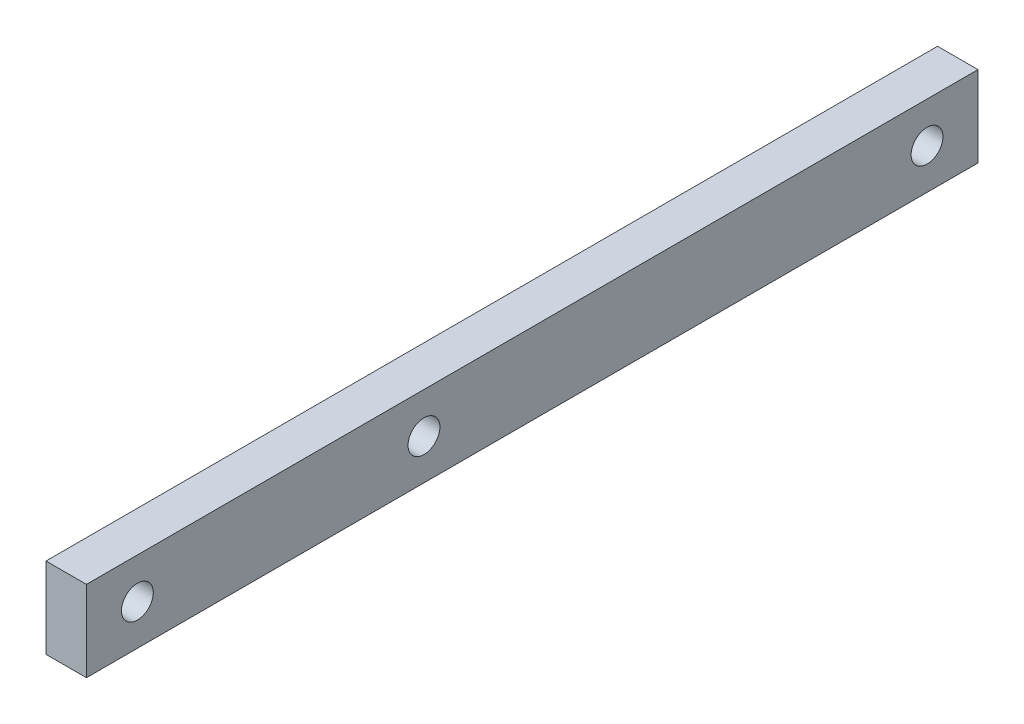
ISO-10303-21;
HEADER;
FILE_DESCRIPTION(('STEP AP214'),'2;1');
FILE_NAME('part.step','',(''),(''),'','','');
FILE_SCHEMA(('AUTOMOTIVE_DESIGN { 1 0 10303 214 1 1 1 1 }'));
ENDSEC;
DATA;
#1=APPLICATION_CONTEXT('core data for automotive mechanical design processes');
#2=APPLICATION_PROTOCOL_DEFINITION('international standard','automotive_design',2000,#1);
#3=PRODUCT_CONTEXT('',#1,'mechanical');
#4=PRODUCT('Part','Part','',(#3));
#5=PRODUCT_RELATED_PRODUCT_CATEGORY('part','',(#4));
#6=PRODUCT_DEFINITION_FORMATION('','',#4);
#7=PRODUCT_DEFINITION_CONTEXT('part definition',#1,'design');
#8=PRODUCT_DEFINITION('design','',#6,#7);
#9=PRODUCT_DEFINITION_SHAPE('','',#8);
#10=(LENGTH_UNIT() NAMED_UNIT(*) SI_UNIT(.MILLI.,.METRE.));
#11=(NAMED_UNIT(*) PLANE_ANGLE_UNIT() SI_UNIT($,.RADIAN.));
#12=(NAMED_UNIT(*) SI_UNIT($,.STERADIAN.) SOLID_ANGLE_UNIT());
#13=UNCERTAINTY_MEASURE_WITH_UNIT(LENGTH_MEASURE(1.E-05),#10,'distance_accuracy_value','');
#14=(GEOMETRIC_REPRESENTATION_CONTEXT(3) GLOBAL_UNCERTAINTY_ASSIGNED_CONTEXT((#13)) GLOBAL_UNIT_ASSIGNED_CONTEXT((#10,
#11,#12)) REPRESENTATION_CONTEXT('',''));
#15=CARTESIAN_POINT('',(0.,0.,0.));
#16=DIRECTION('',(0.,0.,1.));
#17=DIRECTION('',(1.,0.,0.));
#18=AXIS2_PLACEMENT_3D('',#15,#16,#17);
#19=CARTESIAN_POINT('',(3.175,-6.35,-70.));
#20=DIRECTION('',(1.,0.,0.));
#21=DIRECTION('',(0.,0.,-1.));
#22=AXIS2_PLACEMENT_3D('',#19,#20,#21);
#23=PLANE('',#22);
#24=CARTESIAN_POINT('',(3.175,0.,62.));
#25=DIRECTION('',(1.,0.,0.));
#26=DIRECTION('',(0.,0.,-1.));
#27=AXIS2_PLACEMENT_3D('',#24,#25,#26);
#28=CIRCLE('',#27,2.49999999999999);
#29=CARTESIAN_POINT('',(3.175,0.,59.5));
#30=VERTEX_POINT('',#29);
#31=EDGE_CURVE('E105',#30,#30,#28,.T.);
#32=ORIENTED_EDGE('',*,*,#31,.F.);
#33=EDGE_LOOP('',(#32));
#34=FACE_BOUND('',#33,.T.);
#35=CARTESIAN_POINT('',(3.175,0.,-62.));
#36=DIRECTION('',(1.,0.,0.));
#37=DIRECTION('',(0.,0.,1.));
#38=AXIS2_PLACEMENT_3D('',#35,#36,#37);
#39=CIRCLE('',#38,2.5);
#40=CARTESIAN_POINT('',(3.175,0.,-59.5));
#41=VERTEX_POINT('',#40);
#42=EDGE_CURVE('E154',#41,#41,#39,.T.);
#43=ORIENTED_EDGE('',*,*,#42,.F.);
#44=EDGE_LOOP('',(#43));
#45=FACE_BOUND('',#44,.T.);
#46=CARTESIAN_POINT('',(3.175,0.,17.));
#47=DIRECTION('',(1.,0.,0.));
#48=DIRECTION('',(0.,0.,-1.));
#49=AXIS2_PLACEMENT_3D('',#46,#47,#48);
#50=CIRCLE('',#49,2.5);
#51=CARTESIAN_POINT('',(3.175,0.,14.5));
#52=VERTEX_POINT('',#51);
#53=EDGE_CURVE('E108',#52,#52,#50,.T.);
#54=ORIENTED_EDGE('',*,*,#53,.F.);
#55=EDGE_LOOP('',(#54));
#56=FACE_BOUND('',#55,.T.);
#57=DIRECTION('',(0.,0.,1.));
#58=VECTOR('',#57,1.);
#59=CARTESIAN_POINT('',(3.175,6.35,-70.));
#60=LINE('',#59,#58);
#61=CARTESIAN_POINT('',(3.175,6.35,-70.));
#62=VERTEX_POINT('',#61);
#63=CARTESIAN_POINT('',(3.175,6.35,70.));
#64=VERTEX_POINT('',#63);
#65=EDGE_CURVE('E42',#62,#64,#60,.T.);
#66=ORIENTED_EDGE('',*,*,#65,.T.);
#67=DIRECTION('',(0.,1.,0.));
#68=VECTOR('',#67,1.);
#69=CARTESIAN_POINT('',(3.175,-6.35,70.));
#70=LINE('',#69,#68);
#71=CARTESIAN_POINT('',(3.175,-6.35,70.));
#72=VERTEX_POINT('',#71);
#73=EDGE_CURVE('E80',#72,#64,#70,.T.);
#74=ORIENTED_EDGE('',*,*,#73,.F.);
#75=DIRECTION('',(0.,0.,1.));
#76=VECTOR('',#75,1.);
#77=CARTESIAN_POINT('',(3.175,-6.35,-70.));
#78=LINE('',#77,#76);
#79=CARTESIAN_POINT('',(3.175,-6.35,-70.));
#80=VERTEX_POINT('',#79);
#81=EDGE_CURVE('E11',#80,#72,#78,.T.);
#82=ORIENTED_EDGE('',*,*,#81,.F.);
#83=DIRECTION('',(0.,1.,0.));
#84=VECTOR('',#83,1.);
#85=CARTESIAN_POINT('',(3.175,-6.35,-70.));
#86=LINE('',#85,#84);
#87=EDGE_CURVE('E81',#80,#62,#86,.T.);
#88=ORIENTED_EDGE('',*,*,#87,.T.);
#89=EDGE_LOOP('',(#66,#74,#82,#88));
#90=FACE_BOUND('',#89,.T.);
#91=ADVANCED_FACE('F39',(#34,#45,#56,#90),#23,.T.);
#92=CARTESIAN_POINT('',(-3.175,-6.35,-70.));
#93=DIRECTION('',(0.,-1.,0.));
#94=DIRECTION('',(0.,0.,-1.));
#95=AXIS2_PLACEMENT_3D('',#92,#93,#94);
#96=PLANE('',#95);
#97=ORIENTED_EDGE('',*,*,#81,.T.);
#98=DIRECTION('',(1.,0.,0.));
#99=VECTOR('',#98,1.);
#100=CARTESIAN_POINT('',(-3.175,-6.35,70.));
#101=LINE('',#100,#99);
#102=CARTESIAN_POINT('',(-3.175,-6.35,70.));
#103=VERTEX_POINT('',#102);
#104=EDGE_CURVE('E99',#103,#72,#101,.T.);
#105=ORIENTED_EDGE('',*,*,#104,.F.);
#106=DIRECTION('',(0.,0.,1.));
#107=VECTOR('',#106,1.);
#108=CARTESIAN_POINT('',(-3.175,-6.35,-70.));
#109=LINE('',#108,#107);
#110=CARTESIAN_POINT('',(-3.175,-6.35,-70.));
#111=VERTEX_POINT('',#110);
#112=EDGE_CURVE('E48',#111,#103,#109,.T.);
#113=ORIENTED_EDGE('',*,*,#112,.F.);
#114=DIRECTION('',(1.,0.,0.));
#115=VECTOR('',#114,1.);
#116=CARTESIAN_POINT('',(-3.175,-6.35,-70.));
#117=LINE('',#116,#115);
#118=EDGE_CURVE('E87',#111,#80,#117,.T.);
#119=ORIENTED_EDGE('',*,*,#118,.T.);
#120=EDGE_LOOP('',(#97,#105,#113,#119));
#121=FACE_BOUND('',#120,.T.);
#122=ADVANCED_FACE('F131',(#121),#96,.T.);
#123=CARTESIAN_POINT('',(-3.175,-6.35,-70.));
#124=DIRECTION('',(-1.,0.,0.));
#125=DIRECTION('',(0.,0.,1.));
#126=AXIS2_PLACEMENT_3D('',#123,#124,#125);
#127=PLANE('',#126);
#128=CARTESIAN_POINT('',(-3.175,0.,62.));
#129=DIRECTION('',(1.,0.,0.));
#130=DIRECTION('',(0.,0.,-1.));
#131=AXIS2_PLACEMENT_3D('',#128,#129,#130);
#132=CIRCLE('',#131,2.49999999999999);
#133=CARTESIAN_POINT('',(-3.175,0.,59.5));
#134=VERTEX_POINT('',#133);
#135=EDGE_CURVE('E101',#134,#134,#132,.T.);
#136=ORIENTED_EDGE('',*,*,#135,.T.);
#137=EDGE_LOOP('',(#136));
#138=FACE_BOUND('',#137,.T.);
#139=CARTESIAN_POINT('',(-3.175,0.,-62.));
#140=DIRECTION('',(1.,0.,0.));
#141=DIRECTION('',(0.,0.,1.));
#142=AXIS2_PLACEMENT_3D('',#139,#140,#141);
#143=CIRCLE('',#142,2.5);
#144=CARTESIAN_POINT('',(-3.175,0.,-59.5));
#145=VERTEX_POINT('',#144);
#146=EDGE_CURVE('E165',#145,#145,#143,.T.);
#147=ORIENTED_EDGE('',*,*,#146,.T.);
#148=EDGE_LOOP('',(#147));
#149=FACE_BOUND('',#148,.T.);
#150=CARTESIAN_POINT('',(-3.175,0.,17.));
#151=DIRECTION('',(1.,0.,0.));
#152=DIRECTION('',(0.,0.,-1.));
#153=AXIS2_PLACEMENT_3D('',#150,#151,#152);
#154=CIRCLE('',#153,2.5);
#155=CARTESIAN_POINT('',(-3.175,0.,14.5));
#156=VERTEX_POINT('',#155);
#157=EDGE_CURVE('E159',#156,#156,#154,.T.);
#158=ORIENTED_EDGE('',*,*,#157,.T.);
#159=EDGE_LOOP('',(#158));
#160=FACE_BOUND('',#159,.T.);
#161=ORIENTED_EDGE('',*,*,#112,.T.);
#162=DIRECTION('',(0.,-1.,0.));
#163=VECTOR('',#162,1.);
#164=CARTESIAN_POINT('',(-3.175,-6.35,70.));
#165=LINE('',#164,#163);
#166=CARTESIAN_POINT('',(-3.175,6.35,70.));
#167=VERTEX_POINT('',#166);
#168=EDGE_CURVE('E95',#167,#103,#165,.T.);
#169=ORIENTED_EDGE('',*,*,#168,.F.);
#170=DIRECTION('',(0.,0.,1.));
#171=VECTOR('',#170,1.);
#172=CARTESIAN_POINT('',(-3.175,6.35,-70.));
#173=LINE('',#172,#171);
#174=CARTESIAN_POINT('',(-3.175,6.35,-70.));
#175=VERTEX_POINT('',#174);
#176=EDGE_CURVE('E86',#175,#167,#173,.T.);
#177=ORIENTED_EDGE('',*,*,#176,.F.);
#178=DIRECTION('',(0.,-1.,0.));
#179=VECTOR('',#178,1.);
#180=CARTESIAN_POINT('',(-3.175,-6.35,-70.));
#181=LINE('',#180,#179);
#182=EDGE_CURVE('E120',#175,#111,#181,.T.);
#183=ORIENTED_EDGE('',*,*,#182,.T.);
#184=EDGE_LOOP('',(#161,#169,#177,#183));
#185=FACE_BOUND('',#184,.T.);
#186=ADVANCED_FACE('F128',(#138,#149,#160,#185),#127,.T.);
#187=CARTESIAN_POINT('',(-3.175,6.35,-70.));
#188=DIRECTION('',(0.,1.,0.));
#189=DIRECTION('',(0.,0.,1.));
#190=AXIS2_PLACEMENT_3D('',#187,#188,#189);
#191=PLANE('',#190);
#192=ORIENTED_EDGE('',*,*,#176,.T.);
#193=DIRECTION('',(-1.,0.,0.));
#194=VECTOR('',#193,1.);
#195=CARTESIAN_POINT('',(-3.175,6.35,70.));
#196=LINE('',#195,#194);
#197=EDGE_CURVE('E89',#64,#167,#196,.T.);
#198=ORIENTED_EDGE('',*,*,#197,.F.);
#199=ORIENTED_EDGE('',*,*,#65,.F.);
#200=DIRECTION('',(-1.,0.,0.));
#201=VECTOR('',#200,1.);
#202=CARTESIAN_POINT('',(-3.175,6.35,-70.));
#203=LINE('',#202,#201);
#204=EDGE_CURVE('E117',#62,#175,#203,.T.);
#205=ORIENTED_EDGE('',*,*,#204,.T.);
#206=EDGE_LOOP('',(#192,#198,#199,#205));
#207=FACE_BOUND('',#206,.T.);
#208=ADVANCED_FACE('F90',(#207),#191,.T.);
#209=CARTESIAN_POINT('',(0.,0.,-70.));
#210=DIRECTION('',(0.,0.,-1.));
#211=DIRECTION('',(-1.,0.,0.));
#212=AXIS2_PLACEMENT_3D('',#209,#210,#211);
#213=PLANE('',#212);
#214=ORIENTED_EDGE('',*,*,#87,.F.);
#215=ORIENTED_EDGE('',*,*,#118,.F.);
#216=ORIENTED_EDGE('',*,*,#182,.F.);
#217=ORIENTED_EDGE('',*,*,#204,.F.);
#218=EDGE_LOOP('',(#214,#215,#216,#217));
#219=FACE_BOUND('',#218,.T.);
#220=ADVANCED_FACE('F133',(#219),#213,.T.);
#221=CARTESIAN_POINT('',(0.,0.,70.));
#222=DIRECTION('',(0.,0.,-1.));
#223=DIRECTION('',(-1.,0.,0.));
#224=AXIS2_PLACEMENT_3D('',#221,#222,#223);
#225=PLANE('',#224);
#226=ORIENTED_EDGE('',*,*,#73,.T.);
#227=ORIENTED_EDGE('',*,*,#197,.T.);
#228=ORIENTED_EDGE('',*,*,#168,.T.);
#229=ORIENTED_EDGE('',*,*,#104,.T.);
#230=EDGE_LOOP('',(#226,#227,#228,#229));
#231=FACE_BOUND('',#230,.T.);
#232=ADVANCED_FACE('F98',(#231),#225,.F.);
#233=CARTESIAN_POINT('',(-3.175,0.,17.));
#234=DIRECTION('',(1.,0.,0.));
#235=DIRECTION('',(0.,0.,-1.));
#236=AXIS2_PLACEMENT_3D('',#233,#234,#235);
#237=CYLINDRICAL_SURFACE('',#236,2.5);
#238=ORIENTED_EDGE('',*,*,#157,.F.);
#239=EDGE_LOOP('',(#238));
#240=FACE_BOUND('',#239,.T.);
#241=ORIENTED_EDGE('',*,*,#53,.T.);
#242=EDGE_LOOP('',(#241));
#243=FACE_BOUND('',#242,.T.);
#244=ADVANCED_FACE('F140',(#240,#243),#237,.F.);
#245=CARTESIAN_POINT('',(-3.175,0.,-62.));
#246=DIRECTION('',(1.,0.,0.));
#247=DIRECTION('',(0.,0.,-1.));
#248=AXIS2_PLACEMENT_3D('',#245,#246,#247);
#249=CYLINDRICAL_SURFACE('',#248,2.5);
#250=ORIENTED_EDGE('',*,*,#146,.F.);
#251=EDGE_LOOP('',(#250));
#252=FACE_BOUND('',#251,.T.);
#253=ORIENTED_EDGE('',*,*,#42,.T.);
#254=EDGE_LOOP('',(#253));
#255=FACE_BOUND('',#254,.T.);
#256=ADVANCED_FACE('F175',(#252,#255),#249,.F.);
#257=CARTESIAN_POINT('',(-3.175,0.,62.));
#258=DIRECTION('',(1.,0.,0.));
#259=DIRECTION('',(0.,0.,-1.));
#260=AXIS2_PLACEMENT_3D('',#257,#258,#259);
#261=CYLINDRICAL_SURFACE('',#260,2.49999999999999);
#262=ORIENTED_EDGE('',*,*,#135,.F.);
#263=EDGE_LOOP('',(#262));
#264=FACE_BOUND('',#263,.T.);
#265=ORIENTED_EDGE('',*,*,#31,.T.);
#266=EDGE_LOOP('',(#265));
#267=FACE_BOUND('',#266,.T.);
#268=ADVANCED_FACE('F173',(#264,#267),#261,.F.);
#269=CLOSED_SHELL('',(#91,#122,#186,#208,#220,#232,#244,#256,#268));
#270=MANIFOLD_SOLID_BREP('B2',#269);
#271=ADVANCED_BREP_SHAPE_REPRESENTATION('',(#18,#270),#14);
#272=SHAPE_DEFINITION_REPRESENTATION(#9,#271);
ENDSEC;
END-ISO-10303-21;
